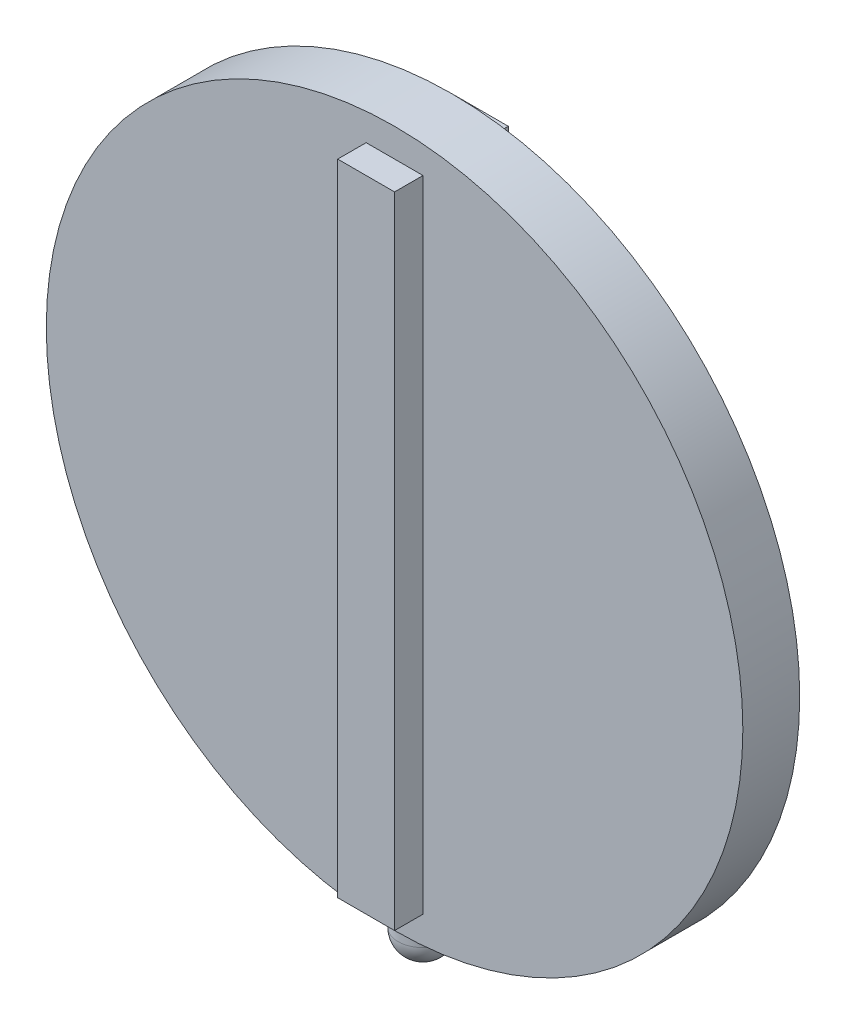
ISO-10303-21;
HEADER;
FILE_DESCRIPTION(('STEP AP214'),'2;1');
FILE_NAME('part.step','',(''),(''),'','','');
FILE_SCHEMA(('AUTOMOTIVE_DESIGN { 1 0 10303 214 1 1 1 1 }'));
ENDSEC;
DATA;
#1=APPLICATION_CONTEXT('core data for automotive mechanical design processes');
#2=APPLICATION_PROTOCOL_DEFINITION('international standard','automotive_design',2000,#1);
#3=PRODUCT_CONTEXT('',#1,'mechanical');
#4=PRODUCT('Part','Part','',(#3));
#5=PRODUCT_RELATED_PRODUCT_CATEGORY('part','',(#4));
#6=PRODUCT_DEFINITION_FORMATION('','',#4);
#7=PRODUCT_DEFINITION_CONTEXT('part definition',#1,'design');
#8=PRODUCT_DEFINITION('design','',#6,#7);
#9=PRODUCT_DEFINITION_SHAPE('','',#8);
#10=(LENGTH_UNIT() NAMED_UNIT(*) SI_UNIT(.MILLI.,.METRE.));
#11=(NAMED_UNIT(*) PLANE_ANGLE_UNIT() SI_UNIT($,.RADIAN.));
#12=(NAMED_UNIT(*) SI_UNIT($,.STERADIAN.) SOLID_ANGLE_UNIT());
#13=UNCERTAINTY_MEASURE_WITH_UNIT(LENGTH_MEASURE(1.E-05),#10,'distance_accuracy_value','');
#14=(GEOMETRIC_REPRESENTATION_CONTEXT(3) GLOBAL_UNCERTAINTY_ASSIGNED_CONTEXT((#13)) GLOBAL_UNIT_ASSIGNED_CONTEXT((#10,
#11,#12)) REPRESENTATION_CONTEXT('',''));
#15=CARTESIAN_POINT('',(0.,0.,0.));
#16=DIRECTION('',(0.,0.,1.));
#17=DIRECTION('',(1.,0.,0.));
#18=AXIS2_PLACEMENT_3D('',#15,#16,#17);
#19=CARTESIAN_POINT('',(0.,0.,4.));
#20=DIRECTION('',(0.,0.,-1.));
#21=DIRECTION('',(-1.,0.,0.));
#22=AXIS2_PLACEMENT_3D('',#19,#20,#21);
#23=CYLINDRICAL_SURFACE('',#22,24.5);
#24=CARTESIAN_POINT('',(0.,0.,4.));
#25=DIRECTION('',(0.,0.,1.));
#26=DIRECTION('',(1.,0.,0.));
#27=AXIS2_PLACEMENT_3D('',#24,#25,#26);
#28=CIRCLE('',#27,24.5);
#29=CARTESIAN_POINT('',(24.5,0.,4.));
#30=VERTEX_POINT('',#29);
#31=EDGE_CURVE('E174',#30,#30,#28,.T.);
#32=ORIENTED_EDGE('',*,*,#31,.F.);
#33=EDGE_LOOP('',(#32));
#34=FACE_BOUND('',#33,.T.);
#35=CARTESIAN_POINT('',(0.,0.,0.));
#36=DIRECTION('',(0.,0.,1.));
#37=DIRECTION('',(1.,0.,0.));
#38=AXIS2_PLACEMENT_3D('',#35,#36,#37);
#39=CIRCLE('',#38,24.5);
#40=CARTESIAN_POINT('',(24.5,0.,0.));
#41=VERTEX_POINT('',#40);
#42=EDGE_CURVE('E173',#41,#41,#39,.T.);
#43=ORIENTED_EDGE('',*,*,#42,.T.);
#44=EDGE_LOOP('',(#43));
#45=FACE_BOUND('',#44,.T.);
#46=CARTESIAN_POINT('',(0.,-24.5,3.75));
#47=CARTESIAN_POINT('',(-0.0981640092782945,-24.4999991737908,3.74999569268035));
#48=CARTESIAN_POINT('',(-0.196396002092137,-24.4994037287185,3.7417126574672));
#49=CARTESIAN_POINT('',(-0.390145424948695,-24.49708562733,3.70879008715878));
#50=CARTESIAN_POINT('',(-0.485659596290769,-24.4953616728124,3.68413171392265));
#51=CARTESIAN_POINT('',(-0.671139009228974,-24.4909814953329,3.6191722371994));
#52=CARTESIAN_POINT('',(-0.761107231194368,-24.4883257783227,3.57887962192854));
#53=CARTESIAN_POINT('',(-0.932980651226008,-24.4823804269392,3.48380975937202));
#54=CARTESIAN_POINT('',(-1.01488764218777,-24.4790909340073,3.42903574292515));
#55=CARTESIAN_POINT('',(-1.1684929042414,-24.4722405028586,3.30644399838987));
#56=CARTESIAN_POINT('',(-1.24017368096161,-24.4686791151031,3.23860437342571));
#57=CARTESIAN_POINT('',(-1.37114190929861,-24.4616900936023,3.09185285383658));
#58=CARTESIAN_POINT('',(-1.43042883282297,-24.4582624655615,3.01294048765006));
#59=CARTESIAN_POINT('',(-1.53498297550138,-24.451923925747,2.84618102999226));
#60=CARTESIAN_POINT('',(-1.58023524445451,-24.4490135663847,2.75832454230909));
#61=CARTESIAN_POINT('',(-1.65533995987243,-24.4440437435088,2.5762364705909));
#62=CARTESIAN_POINT('',(-1.68519261365666,-24.4419842685402,2.48200497239966));
#63=CARTESIAN_POINT('',(-1.72860104100823,-24.4389528426421,2.2900137528699));
#64=CARTESIAN_POINT('',(-1.74218477937971,-24.4379790257637,2.19226038419903));
#65=CARTESIAN_POINT('',(-1.75275613790723,-24.437223152863,1.99585655996154));
#66=CARTESIAN_POINT('',(-1.74974399457226,-24.4374410798571,1.8972061171992));
#67=CARTESIAN_POINT('',(-1.72723225643021,-24.4390423877724,1.70199944454221));
#68=CARTESIAN_POINT('',(-1.70776297305245,-24.4404236260427,1.6054396990311));
#69=CARTESIAN_POINT('',(-1.65293666262068,-24.4441925427754,1.41696224512512));
#70=CARTESIAN_POINT('',(-1.61757951666128,-24.44658022877,1.32504457147743));
#71=CARTESIAN_POINT('',(-1.53194691497538,-24.4520954510581,1.14836338584104));
#72=CARTESIAN_POINT('',(-1.48165776845248,-24.4552236657888,1.06360653144771));
#73=CARTESIAN_POINT('',(-1.36759858752653,-24.4618667855718,0.903725709688998));
#74=CARTESIAN_POINT('',(-1.30382835369083,-24.4653816963444,0.82860188485637));
#75=CARTESIAN_POINT('',(-1.16444676230169,-24.4724116532123,0.689943300044226));
#76=CARTESIAN_POINT('',(-1.08880918335794,-24.475926681951,0.626434894310814));
#77=CARTESIAN_POINT('',(-0.927931721319608,-24.4825532385693,0.51301338907917));
#78=CARTESIAN_POINT('',(-0.842691833815269,-24.4856647662636,0.463100295824471));
#79=CARTESIAN_POINT('',(-0.665012963681277,-24.4911340903618,0.378288261844201));
#80=CARTESIAN_POINT('',(-0.572573471072192,-24.4934918333113,0.343390385856376));
#81=CARTESIAN_POINT('',(-0.383126830059626,-24.4971872488955,0.28961734589784));
#82=CARTESIAN_POINT('',(-0.28611975132583,-24.4985249370838,0.270741937618903));
#83=CARTESIAN_POINT('',(-0.0905201806466135,-24.5000275151833,0.249582444142259));
#84=CARTESIAN_POINT('',(0.00806835219235948,-24.5001949797523,0.247261935583147));
#85=CARTESIAN_POINT('',(0.204233169369038,-24.4993451003749,0.259182846026261));
#86=CARTESIAN_POINT('',(0.30180946060854,-24.4983277645122,0.273424152029612));
#87=CARTESIAN_POINT('',(0.493076865411166,-24.4952244207205,0.318034262683186));
#88=CARTESIAN_POINT('',(0.586771911916853,-24.493139524699,0.348386288562074));
#89=CARTESIAN_POINT('',(0.767738733798111,-24.4881354782341,0.424339178546177));
#90=CARTESIAN_POINT('',(0.855010433967579,-24.4852163180249,0.469940221155951));
#91=CARTESIAN_POINT('',(1.02081962954254,-24.4788650236019,0.575188952247065));
#92=CARTESIAN_POINT('',(1.09934169832028,-24.4754320076051,0.634860889873011));
#93=CARTESIAN_POINT('',(1.24526721447979,-24.4684420631335,0.766522353846005));
#94=CARTESIAN_POINT('',(1.31267051963102,-24.4648851330744,0.838512037736921));
#95=CARTESIAN_POINT('',(1.43456917550837,-24.4580407208729,0.992922978570641));
#96=CARTESIAN_POINT('',(1.48904084157522,-24.4547537402403,1.07536295848398));
#97=CARTESIAN_POINT('',(1.58336781079665,-24.4488279801602,1.24824058696426));
#98=CARTESIAN_POINT('',(1.62322322629603,-24.4461891957306,1.33867817405262));
#99=CARTESIAN_POINT('',(1.68714559208835,-24.4418610647723,1.52489835954765));
#100=CARTESIAN_POINT('',(1.71122728817277,-24.440170831719,1.62067587484241));
#101=CARTESIAN_POINT('',(1.74296672531109,-24.4379279829198,1.81492735229247));
#102=CARTESIAN_POINT('',(1.75062468907633,-24.4373753517476,1.91340127786521));
#103=CARTESIAN_POINT('',(1.74929698623625,-24.4374704103482,2.11001483513241));
#104=CARTESIAN_POINT('',(1.74034854456987,-24.4381154154997,2.20815472166047));
#105=CARTESIAN_POINT('',(1.70613939943228,-24.4405273732019,2.40153442195957));
#106=CARTESIAN_POINT('',(1.68087866802597,-24.4422943276739,2.49677423076389));
#107=CARTESIAN_POINT('',(1.61477083846468,-24.4467503994501,2.6816545241305));
#108=CARTESIAN_POINT('',(1.57392411698356,-24.4494394944683,2.77129514395007));
#109=CARTESIAN_POINT('',(1.47780841320294,-24.4554368327479,2.94245179308654));
#110=CARTESIAN_POINT('',(1.42253974625438,-24.4587450624708,3.02396799999836));
#111=CARTESIAN_POINT('',(1.2990100157931,-24.4656166284526,3.17675164085138));
#112=CARTESIAN_POINT('',(1.23072168167408,-24.4691804901988,3.24799700168328));
#113=CARTESIAN_POINT('',(1.08313464255052,-24.4761570702403,3.37803972896317));
#114=CARTESIAN_POINT('',(1.00383325977932,-24.4795697515098,3.4368340592015));
#115=CARTESIAN_POINT('',(0.836356609612099,-24.485863987463,3.54036282337649));
#116=CARTESIAN_POINT('',(0.748168387540533,-24.4887447489157,3.58507632807528));
#117=CARTESIAN_POINT('',(0.565578194244125,-24.4936405543869,3.65900596993933));
#118=CARTESIAN_POINT('',(0.471183591867396,-24.4956566044132,3.68824012516418));
#119=CARTESIAN_POINT('',(0.313516197464122,-24.4980717368741,3.72284299085552));
#120=CARTESIAN_POINT('',(0.251260620930141,-24.4987915912767,3.73301355706494));
#121=CARTESIAN_POINT('',(0.126012701861466,-24.4997559876064,3.74659343797198));
#122=CARTESIAN_POINT('',(0.0630203606987661,-24.5000005304185,3.75000276525826));
#123=CARTESIAN_POINT('',(0.,-24.5,3.75));
#124=B_SPLINE_CURVE_WITH_KNOTS('',3,(#46,#47,#48,#49,#50,#51,#52,#53,#54,#55,#56,#57,#58,#59,
#60,#61,#62,#63,#64,#65,#66,#67,#68,#69,#70,#71,#72,#73,#74,#75,#76,#77,#78,#79,#80,#81,#82,#83,
#84,#85,#86,#87,#88,#89,#90,#91,#92,#93,#94,#95,#96,#97,#98,#99,#100,#101,#102,#103,#104,#105,
#106,#107,#108,#109,#110,#111,#112,#113,#114,#115,#116,#117,#118,#119,#120,#121,#122,#123),
.UNSPECIFIED.,.T.,.F.,(4,2,2,2,2,2,2,2,2,2,2,2,2,2,2,2,2,2,2,2,2,2,2,2,2,2,2,2,2,2,2,2,2,2,2,2,
2,2,4),(0.,0.294261953909077,0.588863013681581,0.88330435055771,1.17768005214726,
1.47255346485814,1.76743943933566,2.06263846615438,2.35783351871188,2.65252042588825,
2.94720313347329,3.24134426214949,3.5354875922259,3.82990145253074,4.12431966855569,
4.419397820813,4.71447610858227,5.00957531707662,5.3046700258609,5.59911527946689,
5.89355852412712,6.18769571603007,6.48183635121522,6.77648764832471,7.07114271430343,
7.36633335615157,7.66152172903033,7.95643375477402,8.25134178138601,8.54558954016136,
8.83983780284303,9.13407895474079,9.42831367328684,9.72317159575953,10.0181013373654,
10.3134674052535,10.6084889051556,10.7974026337156,10.9863160105389),.UNSPECIFIED.);
#125=CARTESIAN_POINT('',(0.,-24.5,3.75));
#126=VERTEX_POINT('',#125);
#127=EDGE_CURVE('E177',#126,#126,#124,.T.);
#128=ORIENTED_EDGE('',*,*,#127,.F.);
#129=EDGE_LOOP('',(#128));
#130=FACE_BOUND('',#129,.T.);
#131=ADVANCED_FACE('F41',(#34,#45,#130),#23,.T.);
#132=CARTESIAN_POINT('',(0.,0.,4.));
#133=DIRECTION('',(0.,0.,1.));
#134=DIRECTION('',(1.,0.,0.));
#135=AXIS2_PLACEMENT_3D('',#132,#133,#134);
#136=PLANE('',#135);
#137=ORIENTED_EDGE('',*,*,#31,.T.);
#138=EDGE_LOOP('',(#137));
#139=FACE_BOUND('',#138,.T.);
#140=DIRECTION('',(0.,-1.,0.));
#141=VECTOR('',#140,1.);
#142=CARTESIAN_POINT('',(2.,22.5,4.));
#143=LINE('',#142,#141);
#144=CARTESIAN_POINT('',(2.,22.5,4.));
#145=VERTEX_POINT('',#144);
#146=CARTESIAN_POINT('',(2.,-22.5,4.));
#147=VERTEX_POINT('',#146);
#148=EDGE_CURVE('E157',#145,#147,#143,.T.);
#149=ORIENTED_EDGE('',*,*,#148,.T.);
#150=DIRECTION('',(1.,0.,0.));
#151=VECTOR('',#150,1.);
#152=CARTESIAN_POINT('',(-2.,-22.5,4.));
#153=LINE('',#152,#151);
#154=CARTESIAN_POINT('',(-2.,-22.5,4.));
#155=VERTEX_POINT('',#154);
#156=EDGE_CURVE('E113',#155,#147,#153,.T.);
#157=ORIENTED_EDGE('',*,*,#156,.F.);
#158=DIRECTION('',(0.,-1.,0.));
#159=VECTOR('',#158,1.);
#160=CARTESIAN_POINT('',(-2.,22.5,4.));
#161=LINE('',#160,#159);
#162=CARTESIAN_POINT('',(-2.,22.5,4.));
#163=VERTEX_POINT('',#162);
#164=EDGE_CURVE('E146',#163,#155,#161,.T.);
#165=ORIENTED_EDGE('',*,*,#164,.F.);
#166=DIRECTION('',(1.,0.,0.));
#167=VECTOR('',#166,1.);
#168=CARTESIAN_POINT('',(-2.,22.5,4.));
#169=LINE('',#168,#167);
#170=EDGE_CURVE('E160',#163,#145,#169,.T.);
#171=ORIENTED_EDGE('',*,*,#170,.T.);
#172=EDGE_LOOP('',(#149,#157,#165,#171));
#173=FACE_BOUND('',#172,.T.);
#174=ADVANCED_FACE('F229',(#139,#173),#136,.T.);
#175=CARTESIAN_POINT('',(0.,0.,0.));
#176=DIRECTION('',(0.,0.,1.));
#177=DIRECTION('',(1.,0.,0.));
#178=AXIS2_PLACEMENT_3D('',#175,#176,#177);
#179=PLANE('',#178);
#180=DIRECTION('',(0.,-1.,0.));
#181=VECTOR('',#180,1.);
#182=CARTESIAN_POINT('',(-2.,22.5,0.));
#183=LINE('',#182,#181);
#184=CARTESIAN_POINT('',(-2.,22.5,0.));
#185=VERTEX_POINT('',#184);
#186=CARTESIAN_POINT('',(-2.,-22.5,0.));
#187=VERTEX_POINT('',#186);
#188=EDGE_CURVE('E56',#185,#187,#183,.T.);
#189=ORIENTED_EDGE('',*,*,#188,.T.);
#190=DIRECTION('',(1.,0.,0.));
#191=VECTOR('',#190,1.);
#192=CARTESIAN_POINT('',(-2.,-22.5,0.));
#193=LINE('',#192,#191);
#194=CARTESIAN_POINT('',(2.,-22.5,0.));
#195=VERTEX_POINT('',#194);
#196=EDGE_CURVE('E110',#187,#195,#193,.T.);
#197=ORIENTED_EDGE('',*,*,#196,.T.);
#198=DIRECTION('',(0.,-1.,0.));
#199=VECTOR('',#198,1.);
#200=CARTESIAN_POINT('',(2.,22.5,0.));
#201=LINE('',#200,#199);
#202=CARTESIAN_POINT('',(2.,22.5,0.));
#203=VERTEX_POINT('',#202);
#204=EDGE_CURVE('E123',#203,#195,#201,.T.);
#205=ORIENTED_EDGE('',*,*,#204,.F.);
#206=DIRECTION('',(1.,0.,0.));
#207=VECTOR('',#206,1.);
#208=CARTESIAN_POINT('',(-2.,22.5,0.));
#209=LINE('',#208,#207);
#210=EDGE_CURVE('E61',#185,#203,#209,.T.);
#211=ORIENTED_EDGE('',*,*,#210,.F.);
#212=EDGE_LOOP('',(#189,#197,#205,#211));
#213=FACE_BOUND('',#212,.T.);
#214=ORIENTED_EDGE('',*,*,#42,.F.);
#215=EDGE_LOOP('',(#214));
#216=FACE_BOUND('',#215,.T.);
#217=ADVANCED_FACE('F227',(#213,#216),#179,.F.);
#218=CARTESIAN_POINT('',(-2.,-22.5,6.));
#219=DIRECTION('',(0.,1.,0.));
#220=DIRECTION('',(0.,0.,1.));
#221=AXIS2_PLACEMENT_3D('',#218,#219,#220);
#222=PLANE('',#221);
#223=ORIENTED_EDGE('',*,*,#156,.T.);
#224=DIRECTION('',(0.,0.,-1.));
#225=VECTOR('',#224,1.);
#226=CARTESIAN_POINT('',(2.,-22.5,6.));
#227=LINE('',#226,#225);
#228=CARTESIAN_POINT('',(2.,-22.5,6.));
#229=VERTEX_POINT('',#228);
#230=EDGE_CURVE('E171',#229,#147,#227,.T.);
#231=ORIENTED_EDGE('',*,*,#230,.F.);
#232=DIRECTION('',(1.,0.,0.));
#233=VECTOR('',#232,1.);
#234=CARTESIAN_POINT('',(-2.,-22.5,6.));
#235=LINE('',#234,#233);
#236=CARTESIAN_POINT('',(-2.,-22.5,6.));
#237=VERTEX_POINT('',#236);
#238=EDGE_CURVE('E143',#237,#229,#235,.T.);
#239=ORIENTED_EDGE('',*,*,#238,.F.);
#240=DIRECTION('',(0.,0.,-1.));
#241=VECTOR('',#240,1.);
#242=CARTESIAN_POINT('',(-2.,-22.5,6.));
#243=LINE('',#242,#241);
#244=EDGE_CURVE('E154',#237,#155,#243,.T.);
#245=ORIENTED_EDGE('',*,*,#244,.T.);
#246=EDGE_LOOP('',(#223,#231,#239,#245));
#247=FACE_BOUND('',#246,.T.);
#248=ADVANCED_FACE('F223',(#247),#222,.F.);
#249=CARTESIAN_POINT('',(2.,22.5,6.));
#250=DIRECTION('',(1.,0.,0.));
#251=DIRECTION('',(0.,1.,0.));
#252=AXIS2_PLACEMENT_3D('',#249,#250,#251);
#253=PLANE('',#252);
#254=ORIENTED_EDGE('',*,*,#148,.F.);
#255=DIRECTION('',(0.,0.,-1.));
#256=VECTOR('',#255,1.);
#257=CARTESIAN_POINT('',(2.,22.5,6.));
#258=LINE('',#257,#256);
#259=CARTESIAN_POINT('',(2.,22.5,6.));
#260=VERTEX_POINT('',#259);
#261=EDGE_CURVE('E169',#260,#145,#258,.T.);
#262=ORIENTED_EDGE('',*,*,#261,.F.);
#263=DIRECTION('',(0.,-1.,0.));
#264=VECTOR('',#263,1.);
#265=CARTESIAN_POINT('',(2.,22.5,6.));
#266=LINE('',#265,#264);
#267=EDGE_CURVE('E145',#260,#229,#266,.T.);
#268=ORIENTED_EDGE('',*,*,#267,.T.);
#269=ORIENTED_EDGE('',*,*,#230,.T.);
#270=EDGE_LOOP('',(#254,#262,#268,#269));
#271=FACE_BOUND('',#270,.T.);
#272=ADVANCED_FACE('F219',(#271),#253,.T.);
#273=CARTESIAN_POINT('',(-2.,22.5,6.));
#274=DIRECTION('',(0.,1.,0.));
#275=DIRECTION('',(0.,0.,1.));
#276=AXIS2_PLACEMENT_3D('',#273,#274,#275);
#277=PLANE('',#276);
#278=ORIENTED_EDGE('',*,*,#170,.F.);
#279=DIRECTION('',(0.,0.,-1.));
#280=VECTOR('',#279,1.);
#281=CARTESIAN_POINT('',(-2.,22.5,6.));
#282=LINE('',#281,#280);
#283=CARTESIAN_POINT('',(-2.,22.5,6.));
#284=VERTEX_POINT('',#283);
#285=EDGE_CURVE('E166',#284,#163,#282,.T.);
#286=ORIENTED_EDGE('',*,*,#285,.F.);
#287=DIRECTION('',(1.,0.,0.));
#288=VECTOR('',#287,1.);
#289=CARTESIAN_POINT('',(-2.,22.5,6.));
#290=LINE('',#289,#288);
#291=EDGE_CURVE('E149',#284,#260,#290,.T.);
#292=ORIENTED_EDGE('',*,*,#291,.T.);
#293=ORIENTED_EDGE('',*,*,#261,.T.);
#294=EDGE_LOOP('',(#278,#286,#292,#293));
#295=FACE_BOUND('',#294,.T.);
#296=ADVANCED_FACE('F215',(#295),#277,.T.);
#297=CARTESIAN_POINT('',(-2.,22.5,6.));
#298=DIRECTION('',(1.,0.,0.));
#299=DIRECTION('',(0.,1.,0.));
#300=AXIS2_PLACEMENT_3D('',#297,#298,#299);
#301=PLANE('',#300);
#302=ORIENTED_EDGE('',*,*,#164,.T.);
#303=ORIENTED_EDGE('',*,*,#244,.F.);
#304=DIRECTION('',(0.,-1.,0.));
#305=VECTOR('',#304,1.);
#306=CARTESIAN_POINT('',(-2.,22.5,6.));
#307=LINE('',#306,#305);
#308=EDGE_CURVE('E152',#284,#237,#307,.T.);
#309=ORIENTED_EDGE('',*,*,#308,.F.);
#310=ORIENTED_EDGE('',*,*,#285,.T.);
#311=EDGE_LOOP('',(#302,#303,#309,#310));
#312=FACE_BOUND('',#311,.T.);
#313=ADVANCED_FACE('F211',(#312),#301,.F.);
#314=CARTESIAN_POINT('',(0.,0.,6.));
#315=DIRECTION('',(0.,0.,-1.));
#316=DIRECTION('',(-1.,0.,0.));
#317=AXIS2_PLACEMENT_3D('',#314,#315,#316);
#318=PLANE('',#317);
#319=ORIENTED_EDGE('',*,*,#238,.T.);
#320=ORIENTED_EDGE('',*,*,#267,.F.);
#321=ORIENTED_EDGE('',*,*,#291,.F.);
#322=ORIENTED_EDGE('',*,*,#308,.T.);
#323=EDGE_LOOP('',(#319,#320,#321,#322));
#324=FACE_BOUND('',#323,.T.);
#325=ADVANCED_FACE('F208',(#324),#318,.F.);
#326=CARTESIAN_POINT('',(-2.,-22.5,-2.));
#327=DIRECTION('',(0.,-1.,0.));
#328=DIRECTION('',(0.,0.,-1.));
#329=AXIS2_PLACEMENT_3D('',#326,#327,#328);
#330=PLANE('',#329);
#331=ORIENTED_EDGE('',*,*,#196,.F.);
#332=DIRECTION('',(0.,0.,1.));
#333=VECTOR('',#332,1.);
#334=CARTESIAN_POINT('',(-2.,-22.5,-2.));
#335=LINE('',#334,#333);
#336=CARTESIAN_POINT('',(-2.,-22.5,-2.));
#337=VERTEX_POINT('',#336);
#338=EDGE_CURVE('E105',#337,#187,#335,.T.);
#339=ORIENTED_EDGE('',*,*,#338,.F.);
#340=DIRECTION('',(1.,0.,0.));
#341=VECTOR('',#340,1.);
#342=CARTESIAN_POINT('',(-2.,-22.5,-2.));
#343=LINE('',#342,#341);
#344=CARTESIAN_POINT('',(2.,-22.5,-2.));
#345=VERTEX_POINT('',#344);
#346=EDGE_CURVE('E109',#337,#345,#343,.T.);
#347=ORIENTED_EDGE('',*,*,#346,.T.);
#348=DIRECTION('',(0.,0.,1.));
#349=VECTOR('',#348,1.);
#350=CARTESIAN_POINT('',(2.,-22.5,-2.));
#351=LINE('',#350,#349);
#352=EDGE_CURVE('E132',#345,#195,#351,.T.);
#353=ORIENTED_EDGE('',*,*,#352,.T.);
#354=EDGE_LOOP('',(#331,#339,#347,#353));
#355=FACE_BOUND('',#354,.T.);
#356=ADVANCED_FACE('F107',(#355),#330,.T.);
#357=CARTESIAN_POINT('',(-2.,22.5,-2.));
#358=DIRECTION('',(-1.,0.,0.));
#359=DIRECTION('',(0.,-1.,0.));
#360=AXIS2_PLACEMENT_3D('',#357,#358,#359);
#361=PLANE('',#360);
#362=ORIENTED_EDGE('',*,*,#188,.F.);
#363=DIRECTION('',(0.,0.,1.));
#364=VECTOR('',#363,1.);
#365=CARTESIAN_POINT('',(-2.,22.5,-2.));
#366=LINE('',#365,#364);
#367=CARTESIAN_POINT('',(-2.,22.5,-2.));
#368=VERTEX_POINT('',#367);
#369=EDGE_CURVE('E114',#368,#185,#366,.T.);
#370=ORIENTED_EDGE('',*,*,#369,.F.);
#371=DIRECTION('',(0.,-1.,0.));
#372=VECTOR('',#371,1.);
#373=CARTESIAN_POINT('',(-2.,22.5,-2.));
#374=LINE('',#373,#372);
#375=EDGE_CURVE('E119',#368,#337,#374,.T.);
#376=ORIENTED_EDGE('',*,*,#375,.T.);
#377=ORIENTED_EDGE('',*,*,#338,.T.);
#378=EDGE_LOOP('',(#362,#370,#376,#377));
#379=FACE_BOUND('',#378,.T.);
#380=ADVANCED_FACE('F125',(#379),#361,.T.);
#381=CARTESIAN_POINT('',(-2.,22.5,-2.));
#382=DIRECTION('',(0.,-1.,0.));
#383=DIRECTION('',(0.,0.,-1.));
#384=AXIS2_PLACEMENT_3D('',#381,#382,#383);
#385=PLANE('',#384);
#386=ORIENTED_EDGE('',*,*,#210,.T.);
#387=DIRECTION('',(0.,0.,1.));
#388=VECTOR('',#387,1.);
#389=CARTESIAN_POINT('',(2.,22.5,-2.));
#390=LINE('',#389,#388);
#391=CARTESIAN_POINT('',(2.,22.5,-2.));
#392=VERTEX_POINT('',#391);
#393=EDGE_CURVE('E139',#392,#203,#390,.T.);
#394=ORIENTED_EDGE('',*,*,#393,.F.);
#395=DIRECTION('',(1.,0.,0.));
#396=VECTOR('',#395,1.);
#397=CARTESIAN_POINT('',(-2.,22.5,-2.));
#398=LINE('',#397,#396);
#399=EDGE_CURVE('E127',#368,#392,#398,.T.);
#400=ORIENTED_EDGE('',*,*,#399,.F.);
#401=ORIENTED_EDGE('',*,*,#369,.T.);
#402=EDGE_LOOP('',(#386,#394,#400,#401));
#403=FACE_BOUND('',#402,.T.);
#404=ADVANCED_FACE('F199',(#403),#385,.F.);
#405=CARTESIAN_POINT('',(2.,22.5,-2.));
#406=DIRECTION('',(-1.,0.,0.));
#407=DIRECTION('',(0.,-1.,0.));
#408=AXIS2_PLACEMENT_3D('',#405,#406,#407);
#409=PLANE('',#408);
#410=ORIENTED_EDGE('',*,*,#204,.T.);
#411=ORIENTED_EDGE('',*,*,#352,.F.);
#412=DIRECTION('',(0.,-1.,0.));
#413=VECTOR('',#412,1.);
#414=CARTESIAN_POINT('',(2.,22.5,-2.));
#415=LINE('',#414,#413);
#416=EDGE_CURVE('E121',#392,#345,#415,.T.);
#417=ORIENTED_EDGE('',*,*,#416,.F.);
#418=ORIENTED_EDGE('',*,*,#393,.T.);
#419=EDGE_LOOP('',(#410,#411,#417,#418));
#420=FACE_BOUND('',#419,.T.);
#421=ADVANCED_FACE('F196',(#420),#409,.F.);
#422=CARTESIAN_POINT('',(0.,0.,-2.));
#423=DIRECTION('',(0.,0.,1.));
#424=DIRECTION('',(-1.,0.,0.));
#425=AXIS2_PLACEMENT_3D('',#422,#423,#424);
#426=PLANE('',#425);
#427=ORIENTED_EDGE('',*,*,#346,.F.);
#428=ORIENTED_EDGE('',*,*,#375,.F.);
#429=ORIENTED_EDGE('',*,*,#399,.T.);
#430=ORIENTED_EDGE('',*,*,#416,.T.);
#431=EDGE_LOOP('',(#427,#428,#429,#430));
#432=FACE_BOUND('',#431,.T.);
#433=ADVANCED_FACE('F118',(#432),#426,.F.);
#434=CARTESIAN_POINT('',(0.,-27.,2.));
#435=DIRECTION('',(0.,1.,0.));
#436=DIRECTION('',(0.,0.,1.));
#437=AXIS2_PLACEMENT_3D('',#434,#435,#436);
#438=CYLINDRICAL_SURFACE('',#437,1.75);
#439=CARTESIAN_POINT('',(0.,-25.3,2.));
#440=DIRECTION('',(0.,-1.,0.));
#441=DIRECTION('',(0.,0.,-1.));
#442=AXIS2_PLACEMENT_3D('',#439,#440,#441);
#443=CIRCLE('',#442,1.75);
#444=CARTESIAN_POINT('',(0.,-25.3,0.25));
#445=VERTEX_POINT('',#444);
#446=EDGE_CURVE('E11',#445,#445,#443,.F.);
#447=ORIENTED_EDGE('',*,*,#446,.T.);
#448=EDGE_LOOP('',(#447));
#449=FACE_BOUND('',#448,.T.);
#450=ORIENTED_EDGE('',*,*,#127,.T.);
#451=EDGE_LOOP('',(#450));
#452=FACE_BOUND('',#451,.T.);
#453=ADVANCED_FACE('F187',(#449,#452),#438,.T.);
#454=CARTESIAN_POINT('',(0.,-27.,2.));
#455=DIRECTION('',(0.,-1.,0.));
#456=DIRECTION('',(0.,0.,-1.));
#457=AXIS2_PLACEMENT_3D('',#454,#455,#456);
#458=PLANE('',#457);
#459=CARTESIAN_POINT('',(0.,-27.,2.));
#460=DIRECTION('',(0.,-1.,0.));
#461=DIRECTION('',(0.,0.,-1.));
#462=AXIS2_PLACEMENT_3D('',#459,#460,#461);
#463=CIRCLE('',#462,0.0500000000000001);
#464=CARTESIAN_POINT('',(0.,-27.,1.95));
#465=VERTEX_POINT('',#464);
#466=EDGE_CURVE('E49',#465,#465,#463,.T.);
#467=ORIENTED_EDGE('',*,*,#466,.T.);
#468=EDGE_LOOP('',(#467));
#469=FACE_BOUND('',#468,.T.);
#470=ADVANCED_FACE('F192',(#469),#458,.T.);
#471=CARTESIAN_POINT('',(0.,-25.3,2.));
#472=DIRECTION('',(0.,-1.,0.));
#473=DIRECTION('',(0.,0.,-1.));
#474=AXIS2_PLACEMENT_3D('',#471,#472,#473);
#475=DEGENERATE_TOROIDAL_SURFACE('',#474,0.0500000000000001,1.7,.T.);
#476=ORIENTED_EDGE('',*,*,#446,.F.);
#477=EDGE_LOOP('',(#476));
#478=FACE_BOUND('',#477,.T.);
#479=ORIENTED_EDGE('',*,*,#466,.F.);
#480=EDGE_LOOP('',(#479));
#481=FACE_BOUND('',#480,.T.);
#482=ADVANCED_FACE('F43',(#478,#481),#475,.T.);
#483=CLOSED_SHELL('',(#131,#174,#217,#248,#272,#296,#313,#325,#356,#380,#404,#421,#433,#453,
#470,#482));
#484=MANIFOLD_SOLID_BREP('B2',#483);
#485=ADVANCED_BREP_SHAPE_REPRESENTATION('',(#18,#484),#14);
#486=SHAPE_DEFINITION_REPRESENTATION(#9,#485);
ENDSEC;
END-ISO-10303-21;
